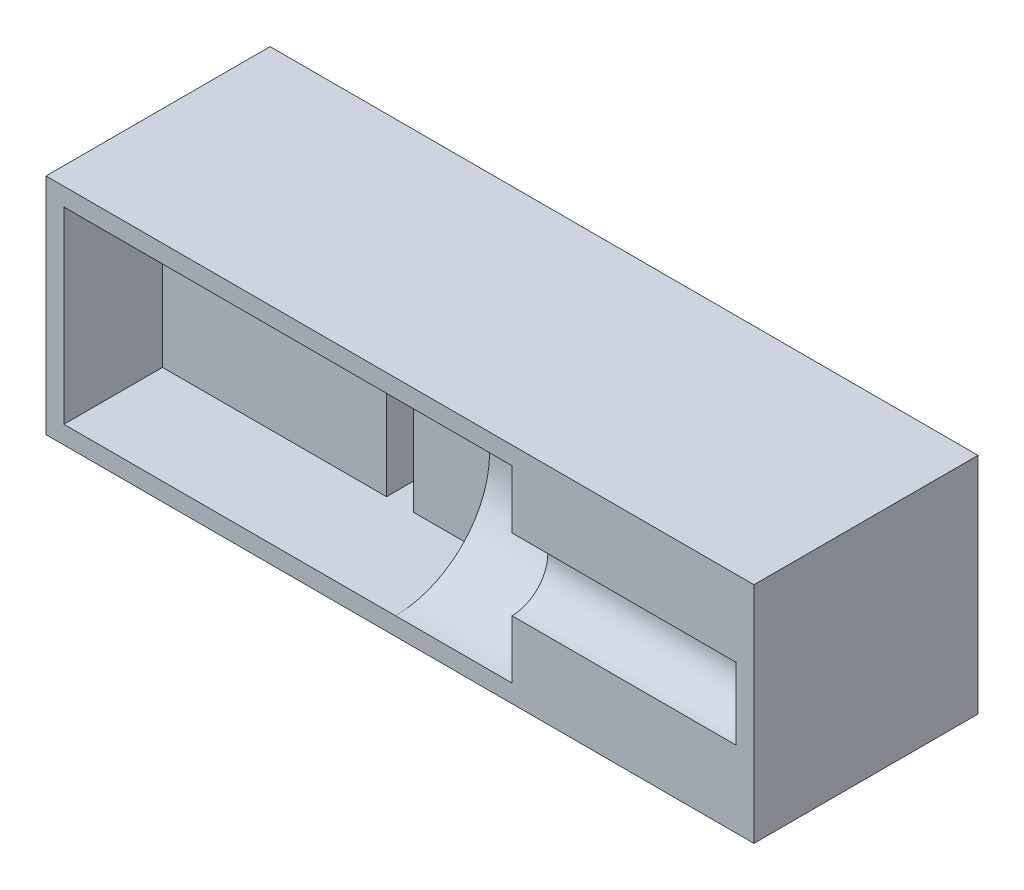
ISO-10303-21;
HEADER;
FILE_DESCRIPTION(('STEP AP214'),'2;1');
FILE_NAME('part.step','',(''),(''),'','','');
FILE_SCHEMA(('AUTOMOTIVE_DESIGN { 1 0 10303 214 1 1 1 1 }'));
ENDSEC;
DATA;
#1=APPLICATION_CONTEXT('core data for automotive mechanical design processes');
#2=APPLICATION_PROTOCOL_DEFINITION('international standard','automotive_design',2000,#1);
#3=PRODUCT_CONTEXT('',#1,'mechanical');
#4=PRODUCT('Part','Part','',(#3));
#5=PRODUCT_RELATED_PRODUCT_CATEGORY('part','',(#4));
#6=PRODUCT_DEFINITION_FORMATION('','',#4);
#7=PRODUCT_DEFINITION_CONTEXT('part definition',#1,'design');
#8=PRODUCT_DEFINITION('design','',#6,#7);
#9=PRODUCT_DEFINITION_SHAPE('','',#8);
#10=(LENGTH_UNIT() NAMED_UNIT(*) SI_UNIT(.MILLI.,.METRE.));
#11=(NAMED_UNIT(*) PLANE_ANGLE_UNIT() SI_UNIT($,.RADIAN.));
#12=(NAMED_UNIT(*) SI_UNIT($,.STERADIAN.) SOLID_ANGLE_UNIT());
#13=UNCERTAINTY_MEASURE_WITH_UNIT(LENGTH_MEASURE(1.E-05),#10,'distance_accuracy_value','');
#14=(GEOMETRIC_REPRESENTATION_CONTEXT(3) GLOBAL_UNCERTAINTY_ASSIGNED_CONTEXT((#13)) GLOBAL_UNIT_ASSIGNED_CONTEXT((#10,
#11,#12)) REPRESENTATION_CONTEXT('',''));
#15=CARTESIAN_POINT('',(0.,0.,0.));
#16=DIRECTION('',(0.,0.,1.));
#17=DIRECTION('',(1.,0.,0.));
#18=AXIS2_PLACEMENT_3D('',#15,#16,#17);
#19=CARTESIAN_POINT('',(0.,0.,14.));
#20=DIRECTION('',(0.,0.,1.));
#21=DIRECTION('',(1.,0.,0.));
#22=AXIS2_PLACEMENT_3D('',#19,#20,#21);
#23=PLANE('',#22);
#24=DIRECTION('',(0.,-1.,0.));
#25=VECTOR('',#24,1.);
#26=CARTESIAN_POINT('',(-3.,10.5,14.));
#27=LINE('',#26,#25);
#28=CARTESIAN_POINT('',(-3.,10.5,14.));
#29=VERTEX_POINT('',#28);
#30=CARTESIAN_POINT('',(-3.,-10.5,14.));
#31=VERTEX_POINT('',#30);
#32=EDGE_CURVE('E185',#29,#31,#27,.T.);
#33=ORIENTED_EDGE('',*,*,#32,.F.);
#34=DIRECTION('',(-1.,0.,0.));
#35=VECTOR('',#34,1.);
#36=CARTESIAN_POINT('',(-28.,10.5,14.));
#37=LINE('',#36,#35);
#38=CARTESIAN_POINT('',(-28.,10.5,14.));
#39=VERTEX_POINT('',#38);
#40=EDGE_CURVE('E278',#29,#39,#37,.T.);
#41=ORIENTED_EDGE('',*,*,#40,.T.);
#42=DIRECTION('',(0.,-1.,0.));
#43=VECTOR('',#42,1.);
#44=CARTESIAN_POINT('',(-28.,10.5,14.));
#45=LINE('',#44,#43);
#46=CARTESIAN_POINT('',(-28.,-10.5,14.));
#47=VERTEX_POINT('',#46);
#48=EDGE_CURVE('E242',#39,#47,#45,.T.);
#49=ORIENTED_EDGE('',*,*,#48,.T.);
#50=DIRECTION('',(1.,0.,0.));
#51=VECTOR('',#50,1.);
#52=CARTESIAN_POINT('',(-28.,-10.5,14.));
#53=LINE('',#52,#51);
#54=EDGE_CURVE('E268',#47,#31,#53,.T.);
#55=ORIENTED_EDGE('',*,*,#54,.T.);
#56=EDGE_LOOP('',(#33,#41,#49,#55));
#57=FACE_BOUND('',#56,.T.);
#58=ADVANCED_FACE('F32',(#57),#23,.T.);
#59=CARTESIAN_POINT('',(-30.,12.5,25.));
#60=DIRECTION('',(0.,-1.,0.));
#61=DIRECTION('',(0.,0.,-1.));
#62=AXIS2_PLACEMENT_3D('',#59,#60,#61);
#63=PLANE('',#62);
#64=DIRECTION('',(-1.,0.,0.));
#65=VECTOR('',#64,1.);
#66=CARTESIAN_POINT('',(-30.,12.5,0.));
#67=LINE('',#66,#65);
#68=CARTESIAN_POINT('',(49.,12.5,0.));
#69=VERTEX_POINT('',#68);
#70=CARTESIAN_POINT('',(-30.,12.5,0.));
#71=VERTEX_POINT('',#70);
#72=EDGE_CURVE('E245',#69,#71,#67,.T.);
#73=ORIENTED_EDGE('',*,*,#72,.T.);
#74=DIRECTION('',(0.,0.,-1.));
#75=VECTOR('',#74,1.);
#76=CARTESIAN_POINT('',(-30.,12.5,25.));
#77=LINE('',#76,#75);
#78=CARTESIAN_POINT('',(-30.,12.5,25.));
#79=VERTEX_POINT('',#78);
#80=EDGE_CURVE('E11',#79,#71,#77,.T.);
#81=ORIENTED_EDGE('',*,*,#80,.F.);
#82=DIRECTION('',(-1.,0.,0.));
#83=VECTOR('',#82,1.);
#84=CARTESIAN_POINT('',(-30.,12.5,25.));
#85=LINE('',#84,#83);
#86=CARTESIAN_POINT('',(49.,12.5,25.));
#87=VERTEX_POINT('',#86);
#88=EDGE_CURVE('E255',#87,#79,#85,.T.);
#89=ORIENTED_EDGE('',*,*,#88,.F.);
#90=DIRECTION('',(0.,0.,1.));
#91=VECTOR('',#90,1.);
#92=CARTESIAN_POINT('',(49.,12.5,0.));
#93=LINE('',#92,#91);
#94=EDGE_CURVE('E165',#69,#87,#93,.T.);
#95=ORIENTED_EDGE('',*,*,#94,.F.);
#96=EDGE_LOOP('',(#73,#81,#89,#95));
#97=FACE_BOUND('',#96,.T.);
#98=ADVANCED_FACE('F34',(#97),#63,.F.);
#99=CARTESIAN_POINT('',(-30.,-12.5,25.));
#100=DIRECTION('',(1.,0.,0.));
#101=DIRECTION('',(0.,0.,-1.));
#102=AXIS2_PLACEMENT_3D('',#99,#100,#101);
#103=PLANE('',#102);
#104=DIRECTION('',(0.,-1.,0.));
#105=VECTOR('',#104,1.);
#106=CARTESIAN_POINT('',(-30.,-12.5,0.));
#107=LINE('',#106,#105);
#108=CARTESIAN_POINT('',(-30.,-12.5,0.));
#109=VERTEX_POINT('',#108);
#110=EDGE_CURVE('E263',#71,#109,#107,.T.);
#111=ORIENTED_EDGE('',*,*,#110,.T.);
#112=DIRECTION('',(0.,0.,-1.));
#113=VECTOR('',#112,1.);
#114=CARTESIAN_POINT('',(-30.,-12.5,25.));
#115=LINE('',#114,#113);
#116=CARTESIAN_POINT('',(-30.,-12.5,25.));
#117=VERTEX_POINT('',#116);
#118=EDGE_CURVE('E41',#117,#109,#115,.T.);
#119=ORIENTED_EDGE('',*,*,#118,.F.);
#120=DIRECTION('',(0.,-1.,0.));
#121=VECTOR('',#120,1.);
#122=CARTESIAN_POINT('',(-30.,-12.5,25.));
#123=LINE('',#122,#121);
#124=EDGE_CURVE('E257',#79,#117,#123,.T.);
#125=ORIENTED_EDGE('',*,*,#124,.F.);
#126=ORIENTED_EDGE('',*,*,#80,.T.);
#127=EDGE_LOOP('',(#111,#119,#125,#126));
#128=FACE_BOUND('',#127,.T.);
#129=ADVANCED_FACE('F311',(#128),#103,.F.);
#130=CARTESIAN_POINT('',(-30.,-12.5,25.));
#131=DIRECTION('',(0.,1.,0.));
#132=DIRECTION('',(0.,0.,1.));
#133=AXIS2_PLACEMENT_3D('',#130,#131,#132);
#134=PLANE('',#133);
#135=DIRECTION('',(1.,0.,0.));
#136=VECTOR('',#135,1.);
#137=CARTESIAN_POINT('',(-30.,-12.5,0.));
#138=LINE('',#137,#136);
#139=CARTESIAN_POINT('',(49.,-12.5,0.));
#140=VERTEX_POINT('',#139);
#141=EDGE_CURVE('E258',#109,#140,#138,.T.);
#142=ORIENTED_EDGE('',*,*,#141,.T.);
#143=DIRECTION('',(0.,0.,-1.));
#144=VECTOR('',#143,1.);
#145=CARTESIAN_POINT('',(49.,-12.5,0.));
#146=LINE('',#145,#144);
#147=CARTESIAN_POINT('',(49.,-12.5,25.));
#148=VERTEX_POINT('',#147);
#149=EDGE_CURVE('E171',#148,#140,#146,.T.);
#150=ORIENTED_EDGE('',*,*,#149,.F.);
#151=DIRECTION('',(1.,0.,0.));
#152=VECTOR('',#151,1.);
#153=CARTESIAN_POINT('',(-30.,-12.5,25.));
#154=LINE('',#153,#152);
#155=EDGE_CURVE('E260',#117,#148,#154,.T.);
#156=ORIENTED_EDGE('',*,*,#155,.F.);
#157=ORIENTED_EDGE('',*,*,#118,.T.);
#158=EDGE_LOOP('',(#142,#150,#156,#157));
#159=FACE_BOUND('',#158,.T.);
#160=ADVANCED_FACE('F333',(#159),#134,.F.);
#161=CARTESIAN_POINT('',(0.,0.,25.));
#162=DIRECTION('',(0.,0.,-1.));
#163=DIRECTION('',(-1.,0.,0.));
#164=AXIS2_PLACEMENT_3D('',#161,#162,#163);
#165=PLANE('',#164);
#166=DIRECTION('',(0.,1.,0.));
#167=VECTOR('',#166,1.);
#168=CARTESIAN_POINT('',(47.,4.,25.));
#169=LINE('',#168,#167);
#170=CARTESIAN_POINT('',(47.,-4.,25.));
#171=VERTEX_POINT('',#170);
#172=CARTESIAN_POINT('',(47.,4.,25.));
#173=VERTEX_POINT('',#172);
#174=EDGE_CURVE('E150',#171,#173,#169,.T.);
#175=ORIENTED_EDGE('',*,*,#174,.F.);
#176=DIRECTION('',(-1.,0.,0.));
#177=VECTOR('',#176,1.);
#178=CARTESIAN_POINT('',(47.,-4.,25.));
#179=LINE('',#178,#177);
#180=CARTESIAN_POINT('',(22.,-4.,25.));
#181=VERTEX_POINT('',#180);
#182=EDGE_CURVE('E140',#171,#181,#179,.T.);
#183=ORIENTED_EDGE('',*,*,#182,.T.);
#184=DIRECTION('',(0.,1.,0.));
#185=VECTOR('',#184,1.);
#186=CARTESIAN_POINT('',(22.,-10.5,25.));
#187=LINE('',#186,#185);
#188=CARTESIAN_POINT('',(22.,-10.5,25.));
#189=VERTEX_POINT('',#188);
#190=EDGE_CURVE('E179',#189,#181,#187,.T.);
#191=ORIENTED_EDGE('',*,*,#190,.F.);
#192=DIRECTION('',(-1.,0.,0.));
#193=VECTOR('',#192,1.);
#194=CARTESIAN_POINT('',(22.,-10.5,25.));
#195=LINE('',#194,#193);
#196=CARTESIAN_POINT('',(8.99999999999999,-10.5,25.));
#197=VERTEX_POINT('',#196);
#198=EDGE_CURVE('E181',#189,#197,#195,.T.);
#199=ORIENTED_EDGE('',*,*,#198,.T.);
#200=DIRECTION('',(1.,0.,0.));
#201=VECTOR('',#200,1.);
#202=CARTESIAN_POINT('',(-28.,-10.5,25.));
#203=LINE('',#202,#201);
#204=CARTESIAN_POINT('',(-28.,-10.5,25.));
#205=VERTEX_POINT('',#204);
#206=EDGE_CURVE('E228',#205,#197,#203,.T.);
#207=ORIENTED_EDGE('',*,*,#206,.F.);
#208=DIRECTION('',(0.,-1.,0.));
#209=VECTOR('',#208,1.);
#210=CARTESIAN_POINT('',(-28.,10.5,25.));
#211=LINE('',#210,#209);
#212=CARTESIAN_POINT('',(-28.,10.5,25.));
#213=VERTEX_POINT('',#212);
#214=EDGE_CURVE('E224',#213,#205,#211,.T.);
#215=ORIENTED_EDGE('',*,*,#214,.F.);
#216=DIRECTION('',(-1.,0.,0.));
#217=VECTOR('',#216,1.);
#218=CARTESIAN_POINT('',(-28.,10.5,25.));
#219=LINE('',#218,#217);
#220=CARTESIAN_POINT('',(8.99999999999999,10.5,25.));
#221=VERTEX_POINT('',#220);
#222=EDGE_CURVE('E234',#221,#213,#219,.T.);
#223=ORIENTED_EDGE('',*,*,#222,.F.);
#224=DIRECTION('',(-1.,0.,0.));
#225=VECTOR('',#224,1.);
#226=CARTESIAN_POINT('',(22.,10.5,25.));
#227=LINE('',#226,#225);
#228=CARTESIAN_POINT('',(22.,10.5,25.));
#229=VERTEX_POINT('',#228);
#230=EDGE_CURVE('E183',#229,#221,#227,.T.);
#231=ORIENTED_EDGE('',*,*,#230,.F.);
#232=CARTESIAN_POINT('',(22.,4.,25.));
#233=VERTEX_POINT('',#232);
#234=EDGE_CURVE('E178',#233,#229,#187,.T.);
#235=ORIENTED_EDGE('',*,*,#234,.F.);
#236=DIRECTION('',(-1.,0.,0.));
#237=VECTOR('',#236,1.);
#238=CARTESIAN_POINT('',(47.,4.,25.));
#239=LINE('',#238,#237);
#240=EDGE_CURVE('E49',#173,#233,#239,.T.);
#241=ORIENTED_EDGE('',*,*,#240,.F.);
#242=EDGE_LOOP('',(#175,#183,#191,#199,#207,#215,#223,#231,#235,#241));
#243=FACE_BOUND('',#242,.T.);
#244=ORIENTED_EDGE('',*,*,#155,.T.);
#245=DIRECTION('',(0.,-1.,0.));
#246=VECTOR('',#245,1.);
#247=CARTESIAN_POINT('',(49.,-12.5,25.));
#248=LINE('',#247,#246);
#249=EDGE_CURVE('E168',#87,#148,#248,.T.);
#250=ORIENTED_EDGE('',*,*,#249,.F.);
#251=ORIENTED_EDGE('',*,*,#88,.T.);
#252=ORIENTED_EDGE('',*,*,#124,.T.);
#253=EDGE_LOOP('',(#244,#250,#251,#252));
#254=FACE_BOUND('',#253,.T.);
#255=ADVANCED_FACE('F155',(#243,#254),#165,.F.);
#256=CARTESIAN_POINT('',(0.,0.,0.));
#257=DIRECTION('',(0.,0.,-1.));
#258=DIRECTION('',(-1.,0.,0.));
#259=AXIS2_PLACEMENT_3D('',#256,#257,#258);
#260=PLANE('',#259);
#261=ORIENTED_EDGE('',*,*,#72,.F.);
#262=DIRECTION('',(0.,1.,0.));
#263=VECTOR('',#262,1.);
#264=CARTESIAN_POINT('',(49.,-12.5,0.));
#265=LINE('',#264,#263);
#266=EDGE_CURVE('E161',#140,#69,#265,.T.);
#267=ORIENTED_EDGE('',*,*,#266,.F.);
#268=ORIENTED_EDGE('',*,*,#141,.F.);
#269=ORIENTED_EDGE('',*,*,#110,.F.);
#270=EDGE_LOOP('',(#261,#267,#268,#269));
#271=FACE_BOUND('',#270,.T.);
#272=ADVANCED_FACE('F330',(#271),#260,.T.);
#273=CARTESIAN_POINT('',(-28.,10.5,14.));
#274=DIRECTION('',(-1.,0.,0.));
#275=DIRECTION('',(0.,-1.,0.));
#276=AXIS2_PLACEMENT_3D('',#273,#274,#275);
#277=PLANE('',#276);
#278=ORIENTED_EDGE('',*,*,#214,.T.);
#279=DIRECTION('',(0.,0.,1.));
#280=VECTOR('',#279,1.);
#281=CARTESIAN_POINT('',(-28.,-10.5,14.));
#282=LINE('',#281,#280);
#283=EDGE_CURVE('E252',#47,#205,#282,.T.);
#284=ORIENTED_EDGE('',*,*,#283,.F.);
#285=ORIENTED_EDGE('',*,*,#48,.F.);
#286=DIRECTION('',(0.,0.,1.));
#287=VECTOR('',#286,1.);
#288=CARTESIAN_POINT('',(-28.,10.5,14.));
#289=LINE('',#288,#287);
#290=EDGE_CURVE('E243',#39,#213,#289,.T.);
#291=ORIENTED_EDGE('',*,*,#290,.T.);
#292=EDGE_LOOP('',(#278,#284,#285,#291));
#293=FACE_BOUND('',#292,.T.);
#294=ADVANCED_FACE('F327',(#293),#277,.F.);
#295=CARTESIAN_POINT('',(-28.,10.5,14.));
#296=DIRECTION('',(0.,1.,0.));
#297=DIRECTION('',(0.,0.,1.));
#298=AXIS2_PLACEMENT_3D('',#295,#296,#297);
#299=PLANE('',#298);
#300=ORIENTED_EDGE('',*,*,#222,.T.);
#301=ORIENTED_EDGE('',*,*,#290,.F.);
#302=ORIENTED_EDGE('',*,*,#40,.F.);
#303=DIRECTION('',(0.,0.,1.));
#304=VECTOR('',#303,1.);
#305=CARTESIAN_POINT('',(-3.,10.5,6.));
#306=LINE('',#305,#304);
#307=CARTESIAN_POINT('',(-3.,10.5,6.));
#308=VERTEX_POINT('',#307);
#309=EDGE_CURVE('E216',#308,#29,#306,.T.);
#310=ORIENTED_EDGE('',*,*,#309,.F.);
#311=DIRECTION('',(-1.,0.,0.));
#312=VECTOR('',#311,1.);
#313=CARTESIAN_POINT('',(-3.,10.5,6.));
#314=LINE('',#313,#312);
#315=CARTESIAN_POINT('',(0.,10.5,6.));
#316=VERTEX_POINT('',#315);
#317=EDGE_CURVE('E198',#316,#308,#314,.T.);
#318=ORIENTED_EDGE('',*,*,#317,.F.);
#319=DIRECTION('',(0.,0.,1.));
#320=VECTOR('',#319,1.);
#321=CARTESIAN_POINT('',(0.,10.5,6.));
#322=LINE('',#321,#320);
#323=CARTESIAN_POINT('',(0.,10.5,14.));
#324=VERTEX_POINT('',#323);
#325=EDGE_CURVE('E214',#316,#324,#322,.T.);
#326=ORIENTED_EDGE('',*,*,#325,.T.);
#327=CARTESIAN_POINT('',(8.99999999999999,10.5,14.));
#328=VERTEX_POINT('',#327);
#329=EDGE_CURVE('E254',#328,#324,#37,.T.);
#330=ORIENTED_EDGE('',*,*,#329,.F.);
#331=DIRECTION('',(0.,0.,1.));
#332=VECTOR('',#331,1.);
#333=CARTESIAN_POINT('',(8.99999999999999,10.5,14.));
#334=LINE('',#333,#332);
#335=EDGE_CURVE('E246',#328,#221,#334,.T.);
#336=ORIENTED_EDGE('',*,*,#335,.T.);
#337=EDGE_LOOP('',(#300,#301,#302,#310,#318,#326,#330,#336));
#338=FACE_BOUND('',#337,.T.);
#339=ADVANCED_FACE('F290',(#338),#299,.F.);
#340=CARTESIAN_POINT('',(8.99999999999999,10.5,14.));
#341=DIRECTION('',(1.,0.,0.));
#342=DIRECTION('',(0.,0.,-1.));
#343=AXIS2_PLACEMENT_3D('',#340,#341,#342);
#344=PLANE('',#343);
#345=DIRECTION('',(0.,0.,1.));
#346=VECTOR('',#345,1.);
#347=CARTESIAN_POINT('',(8.99999999999999,-10.5,14.));
#348=LINE('',#347,#346);
#349=CARTESIAN_POINT('',(8.99999999999999,-10.5,14.));
#350=VERTEX_POINT('',#349);
#351=EDGE_CURVE('E249',#350,#197,#348,.T.);
#352=ORIENTED_EDGE('',*,*,#351,.T.);
#353=CARTESIAN_POINT('',(8.99999999999999,0.,25.));
#354=DIRECTION('',(-1.,0.,0.));
#355=DIRECTION('',(0.,0.,1.));
#356=AXIS2_PLACEMENT_3D('',#353,#354,#355);
#357=CIRCLE('',#356,10.5);
#358=EDGE_CURVE('E174',#221,#197,#357,.T.);
#359=ORIENTED_EDGE('',*,*,#358,.F.);
#360=ORIENTED_EDGE('',*,*,#335,.F.);
#361=DIRECTION('',(0.,1.,0.));
#362=VECTOR('',#361,1.);
#363=CARTESIAN_POINT('',(8.99999999999999,10.5,14.));
#364=LINE('',#363,#362);
#365=EDGE_CURVE('E272',#350,#328,#364,.T.);
#366=ORIENTED_EDGE('',*,*,#365,.F.);
#367=EDGE_LOOP('',(#352,#359,#360,#366));
#368=FACE_BOUND('',#367,.T.);
#369=ADVANCED_FACE('F319',(#368),#344,.F.);
#370=CARTESIAN_POINT('',(-28.,-10.5,14.));
#371=DIRECTION('',(0.,-1.,0.));
#372=DIRECTION('',(0.,0.,-1.));
#373=AXIS2_PLACEMENT_3D('',#370,#371,#372);
#374=PLANE('',#373);
#375=ORIENTED_EDGE('',*,*,#206,.T.);
#376=ORIENTED_EDGE('',*,*,#351,.F.);
#377=CARTESIAN_POINT('',(0.,-10.5,14.));
#378=VERTEX_POINT('',#377);
#379=EDGE_CURVE('E273',#378,#350,#53,.T.);
#380=ORIENTED_EDGE('',*,*,#379,.F.);
#381=DIRECTION('',(0.,0.,1.));
#382=VECTOR('',#381,1.);
#383=CARTESIAN_POINT('',(0.,-10.5,6.));
#384=LINE('',#383,#382);
#385=CARTESIAN_POINT('',(0.,-10.5,6.));
#386=VERTEX_POINT('',#385);
#387=EDGE_CURVE('E57',#386,#378,#384,.T.);
#388=ORIENTED_EDGE('',*,*,#387,.F.);
#389=DIRECTION('',(1.,0.,0.));
#390=VECTOR('',#389,1.);
#391=CARTESIAN_POINT('',(-3.,-10.5,6.));
#392=LINE('',#391,#390);
#393=CARTESIAN_POINT('',(-3.,-10.5,6.));
#394=VERTEX_POINT('',#393);
#395=EDGE_CURVE('E191',#394,#386,#392,.T.);
#396=ORIENTED_EDGE('',*,*,#395,.F.);
#397=DIRECTION('',(0.,0.,1.));
#398=VECTOR('',#397,1.);
#399=CARTESIAN_POINT('',(-3.,-10.5,6.));
#400=LINE('',#399,#398);
#401=EDGE_CURVE('E201',#394,#31,#400,.T.);
#402=ORIENTED_EDGE('',*,*,#401,.T.);
#403=ORIENTED_EDGE('',*,*,#54,.F.);
#404=ORIENTED_EDGE('',*,*,#283,.T.);
#405=EDGE_LOOP('',(#375,#376,#380,#388,#396,#402,#403,#404));
#406=FACE_BOUND('',#405,.T.);
#407=ADVANCED_FACE('F315',(#406),#374,.F.);
#408=DIRECTION('',(0.,1.,0.));
#409=VECTOR('',#408,1.);
#410=CARTESIAN_POINT('',(0.,10.5,14.));
#411=LINE('',#410,#409);
#412=EDGE_CURVE('E192',#378,#324,#411,.T.);
#413=ORIENTED_EDGE('',*,*,#412,.F.);
#414=ORIENTED_EDGE('',*,*,#379,.T.);
#415=ORIENTED_EDGE('',*,*,#365,.T.);
#416=ORIENTED_EDGE('',*,*,#329,.T.);
#417=EDGE_LOOP('',(#413,#414,#415,#416));
#418=FACE_BOUND('',#417,.T.);
#419=ADVANCED_FACE('F287',(#418),#23,.T.);
#420=CARTESIAN_POINT('',(-3.,10.5,6.));
#421=DIRECTION('',(-1.,0.,0.));
#422=DIRECTION('',(0.,-1.,0.));
#423=AXIS2_PLACEMENT_3D('',#420,#421,#422);
#424=PLANE('',#423);
#425=ORIENTED_EDGE('',*,*,#32,.T.);
#426=ORIENTED_EDGE('',*,*,#401,.F.);
#427=DIRECTION('',(0.,-1.,0.));
#428=VECTOR('',#427,1.);
#429=CARTESIAN_POINT('',(-3.,10.5,6.));
#430=LINE('',#429,#428);
#431=EDGE_CURVE('E188',#308,#394,#430,.T.);
#432=ORIENTED_EDGE('',*,*,#431,.F.);
#433=ORIENTED_EDGE('',*,*,#309,.T.);
#434=EDGE_LOOP('',(#425,#426,#432,#433));
#435=FACE_BOUND('',#434,.T.);
#436=ADVANCED_FACE('F296',(#435),#424,.F.);
#437=CARTESIAN_POINT('',(0.,10.5,6.));
#438=DIRECTION('',(1.,0.,0.));
#439=DIRECTION('',(0.,1.,0.));
#440=AXIS2_PLACEMENT_3D('',#437,#438,#439);
#441=PLANE('',#440);
#442=ORIENTED_EDGE('',*,*,#412,.T.);
#443=ORIENTED_EDGE('',*,*,#325,.F.);
#444=DIRECTION('',(0.,1.,0.));
#445=VECTOR('',#444,1.);
#446=CARTESIAN_POINT('',(0.,10.5,6.));
#447=LINE('',#446,#445);
#448=EDGE_CURVE('E195',#386,#316,#447,.T.);
#449=ORIENTED_EDGE('',*,*,#448,.F.);
#450=ORIENTED_EDGE('',*,*,#387,.T.);
#451=EDGE_LOOP('',(#442,#443,#449,#450));
#452=FACE_BOUND('',#451,.T.);
#453=ADVANCED_FACE('F293',(#452),#441,.F.);
#454=CARTESIAN_POINT('',(0.,0.,6.));
#455=DIRECTION('',(0.,0.,1.));
#456=DIRECTION('',(1.,0.,0.));
#457=AXIS2_PLACEMENT_3D('',#454,#455,#456);
#458=PLANE('',#457);
#459=ORIENTED_EDGE('',*,*,#431,.T.);
#460=ORIENTED_EDGE('',*,*,#395,.T.);
#461=ORIENTED_EDGE('',*,*,#448,.T.);
#462=ORIENTED_EDGE('',*,*,#317,.T.);
#463=EDGE_LOOP('',(#459,#460,#461,#462));
#464=FACE_BOUND('',#463,.T.);
#465=ADVANCED_FACE('F295',(#464),#458,.T.);
#466=CARTESIAN_POINT('',(22.,0.,25.));
#467=DIRECTION('',(-1.,0.,0.));
#468=DIRECTION('',(0.,0.,1.));
#469=AXIS2_PLACEMENT_3D('',#466,#467,#468);
#470=CYLINDRICAL_SURFACE('',#469,10.5);
#471=ORIENTED_EDGE('',*,*,#358,.T.);
#472=ORIENTED_EDGE('',*,*,#198,.F.);
#473=CARTESIAN_POINT('',(22.,0.,25.));
#474=DIRECTION('',(-1.,0.,0.));
#475=DIRECTION('',(0.,0.,1.));
#476=AXIS2_PLACEMENT_3D('',#473,#474,#475);
#477=CIRCLE('',#476,10.5);
#478=EDGE_CURVE('E175',#229,#189,#477,.T.);
#479=ORIENTED_EDGE('',*,*,#478,.F.);
#480=ORIENTED_EDGE('',*,*,#230,.T.);
#481=EDGE_LOOP('',(#471,#472,#479,#480));
#482=FACE_BOUND('',#481,.T.);
#483=ADVANCED_FACE('F302',(#482),#470,.F.);
#484=CARTESIAN_POINT('',(22.,0.,25.));
#485=DIRECTION('',(-1.,0.,0.));
#486=DIRECTION('',(0.,0.,1.));
#487=AXIS2_PLACEMENT_3D('',#484,#485,#486);
#488=PLANE('',#487);
#489=CARTESIAN_POINT('',(22.,0.,25.));
#490=DIRECTION('',(-1.,0.,0.));
#491=DIRECTION('',(0.,0.,1.));
#492=AXIS2_PLACEMENT_3D('',#489,#490,#491);
#493=CIRCLE('',#492,4.);
#494=EDGE_CURVE('E145',#233,#181,#493,.T.);
#495=ORIENTED_EDGE('',*,*,#494,.F.);
#496=ORIENTED_EDGE('',*,*,#234,.T.);
#497=ORIENTED_EDGE('',*,*,#478,.T.);
#498=ORIENTED_EDGE('',*,*,#190,.T.);
#499=EDGE_LOOP('',(#495,#496,#497,#498));
#500=FACE_BOUND('',#499,.T.);
#501=ADVANCED_FACE('F356',(#500),#488,.T.);
#502=CARTESIAN_POINT('',(49.,0.,0.));
#503=DIRECTION('',(1.,0.,0.));
#504=DIRECTION('',(0.,0.,-1.));
#505=AXIS2_PLACEMENT_3D('',#502,#503,#504);
#506=PLANE('',#505);
#507=ORIENTED_EDGE('',*,*,#266,.T.);
#508=ORIENTED_EDGE('',*,*,#94,.T.);
#509=ORIENTED_EDGE('',*,*,#249,.T.);
#510=ORIENTED_EDGE('',*,*,#149,.T.);
#511=EDGE_LOOP('',(#507,#508,#509,#510));
#512=FACE_BOUND('',#511,.T.);
#513=ADVANCED_FACE('F353',(#512),#506,.T.);
#514=CARTESIAN_POINT('',(47.,0.,25.));
#515=DIRECTION('',(-1.,0.,0.));
#516=DIRECTION('',(0.,0.,1.));
#517=AXIS2_PLACEMENT_3D('',#514,#515,#516);
#518=CYLINDRICAL_SURFACE('',#517,4.);
#519=ORIENTED_EDGE('',*,*,#494,.T.);
#520=ORIENTED_EDGE('',*,*,#182,.F.);
#521=CARTESIAN_POINT('',(47.,0.,25.));
#522=DIRECTION('',(-1.,0.,0.));
#523=DIRECTION('',(0.,0.,1.));
#524=AXIS2_PLACEMENT_3D('',#521,#522,#523);
#525=CIRCLE('',#524,4.);
#526=EDGE_CURVE('E143',#173,#171,#525,.T.);
#527=ORIENTED_EDGE('',*,*,#526,.F.);
#528=ORIENTED_EDGE('',*,*,#240,.T.);
#529=EDGE_LOOP('',(#519,#520,#527,#528));
#530=FACE_BOUND('',#529,.T.);
#531=ADVANCED_FACE('F142',(#530),#518,.F.);
#532=CARTESIAN_POINT('',(47.,0.,25.));
#533=DIRECTION('',(-1.,0.,0.));
#534=DIRECTION('',(0.,0.,1.));
#535=AXIS2_PLACEMENT_3D('',#532,#533,#534);
#536=PLANE('',#535);
#537=ORIENTED_EDGE('',*,*,#526,.T.);
#538=ORIENTED_EDGE('',*,*,#174,.T.);
#539=EDGE_LOOP('',(#537,#538));
#540=FACE_BOUND('',#539,.T.);
#541=ADVANCED_FACE('F153',(#540),#536,.T.);
#542=CLOSED_SHELL('',(#58,#98,#129,#160,#255,#272,#294,#339,#369,#407,#419,#436,#453,#465,#483,
#501,#513,#531,#541));
#543=MANIFOLD_SOLID_BREP('B2',#542);
#544=ADVANCED_BREP_SHAPE_REPRESENTATION('',(#18,#543),#14);
#545=SHAPE_DEFINITION_REPRESENTATION(#9,#544);
ENDSEC;
END-ISO-10303-21;
